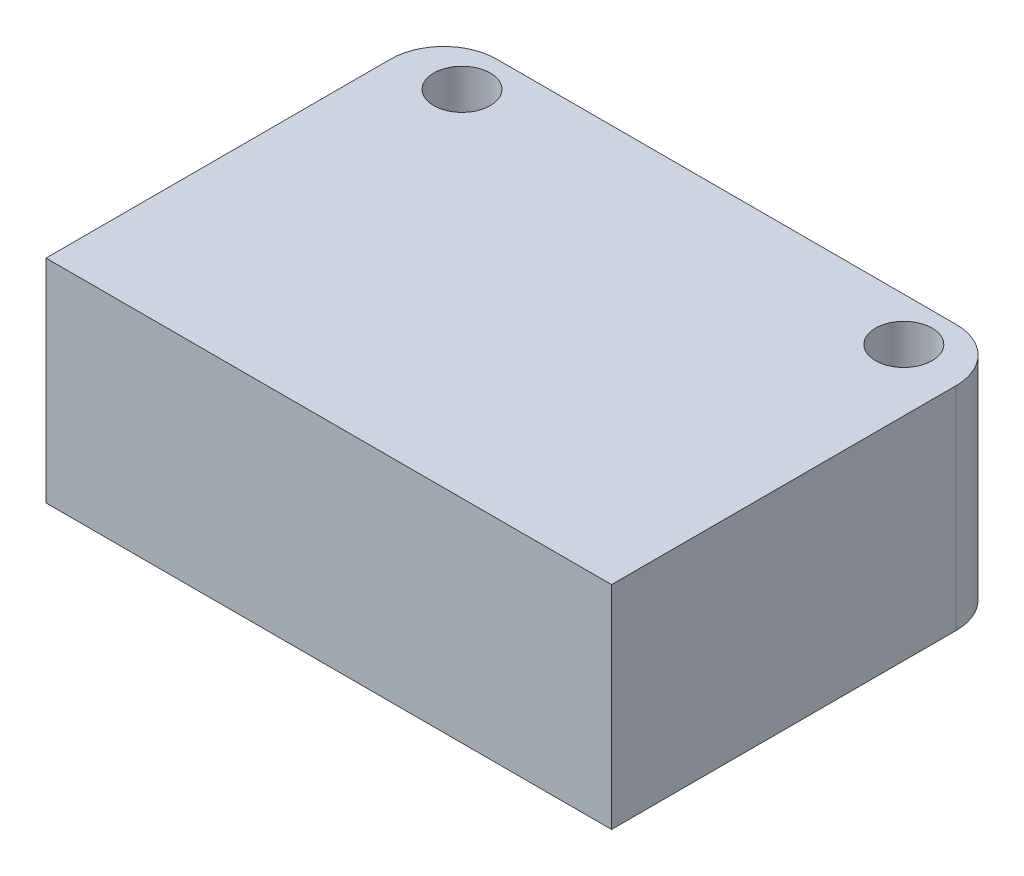
ISO-10303-21;
HEADER;
FILE_DESCRIPTION(('STEP AP214'),'2;1');
FILE_NAME('part.step','',(''),(''),'','','');
FILE_SCHEMA(('AUTOMOTIVE_DESIGN { 1 0 10303 214 1 1 1 1 }'));
ENDSEC;
DATA;
#1=APPLICATION_CONTEXT('core data for automotive mechanical design processes');
#2=APPLICATION_PROTOCOL_DEFINITION('international standard','automotive_design',2000,#1);
#3=PRODUCT_CONTEXT('',#1,'mechanical');
#4=PRODUCT('Part','Part','',(#3));
#5=PRODUCT_RELATED_PRODUCT_CATEGORY('part','',(#4));
#6=PRODUCT_DEFINITION_FORMATION('','',#4);
#7=PRODUCT_DEFINITION_CONTEXT('part definition',#1,'design');
#8=PRODUCT_DEFINITION('design','',#6,#7);
#9=PRODUCT_DEFINITION_SHAPE('','',#8);
#10=(LENGTH_UNIT() NAMED_UNIT(*) SI_UNIT(.MILLI.,.METRE.));
#11=(NAMED_UNIT(*) PLANE_ANGLE_UNIT() SI_UNIT($,.RADIAN.));
#12=(NAMED_UNIT(*) SI_UNIT($,.STERADIAN.) SOLID_ANGLE_UNIT());
#13=UNCERTAINTY_MEASURE_WITH_UNIT(LENGTH_MEASURE(1.E-05),#10,'distance_accuracy_value','');
#14=(GEOMETRIC_REPRESENTATION_CONTEXT(3) GLOBAL_UNCERTAINTY_ASSIGNED_CONTEXT((#13)) GLOBAL_UNIT_ASSIGNED_CONTEXT((#10,
#11,#12)) REPRESENTATION_CONTEXT('',''));
#15=CARTESIAN_POINT('',(0.,0.,0.));
#16=DIRECTION('',(0.,0.,1.));
#17=DIRECTION('',(1.,0.,0.));
#18=AXIS2_PLACEMENT_3D('',#15,#16,#17);
#19=CARTESIAN_POINT('',(-13.,6.,-8.25));
#20=DIRECTION('',(0.,-1.,0.));
#21=DIRECTION('',(0.,0.,-1.));
#22=AXIS2_PLACEMENT_3D('',#19,#20,#21);
#23=PLANE('',#22);
#24=DIRECTION('',(0.,0.,1.));
#25=VECTOR('',#24,1.);
#26=CARTESIAN_POINT('',(-16.,6.,11.25));
#27=LINE('',#26,#25);
#28=CARTESIAN_POINT('',(-16.,6.,-8.25));
#29=VERTEX_POINT('',#28);
#30=CARTESIAN_POINT('',(-16.,6.,11.25));
#31=VERTEX_POINT('',#30);
#32=EDGE_CURVE('E125',#29,#31,#27,.T.);
#33=ORIENTED_EDGE('',*,*,#32,.T.);
#34=DIRECTION('',(1.,0.,0.));
#35=VECTOR('',#34,1.);
#36=CARTESIAN_POINT('',(-16.,6.,11.25));
#37=LINE('',#36,#35);
#38=CARTESIAN_POINT('',(16.,6.,11.25));
#39=VERTEX_POINT('',#38);
#40=EDGE_CURVE('E114',#31,#39,#37,.T.);
#41=ORIENTED_EDGE('',*,*,#40,.T.);
#42=DIRECTION('',(0.,0.,-1.));
#43=VECTOR('',#42,1.);
#44=CARTESIAN_POINT('',(16.,6.,11.25));
#45=LINE('',#44,#43);
#46=CARTESIAN_POINT('',(16.,6.,-8.25));
#47=VERTEX_POINT('',#46);
#48=EDGE_CURVE('E124',#39,#47,#45,.T.);
#49=ORIENTED_EDGE('',*,*,#48,.T.);
#50=CARTESIAN_POINT('',(13.,6.,-8.25));
#51=DIRECTION('',(0.,1.,0.));
#52=DIRECTION('',(0.,0.,-1.));
#53=AXIS2_PLACEMENT_3D('',#50,#51,#52);
#54=CIRCLE('',#53,3.);
#55=CARTESIAN_POINT('',(13.,6.,-11.25));
#56=VERTEX_POINT('',#55);
#57=EDGE_CURVE('E211',#47,#56,#54,.T.);
#58=ORIENTED_EDGE('',*,*,#57,.T.);
#59=DIRECTION('',(-1.,0.,0.));
#60=VECTOR('',#59,1.);
#61=CARTESIAN_POINT('',(-13.,6.,-11.25));
#62=LINE('',#61,#60);
#63=CARTESIAN_POINT('',(-13.,6.,-11.25));
#64=VERTEX_POINT('',#63);
#65=EDGE_CURVE('E213',#56,#64,#62,.T.);
#66=ORIENTED_EDGE('',*,*,#65,.T.);
#67=CARTESIAN_POINT('',(-13.,6.,-8.25));
#68=DIRECTION('',(0.,1.,0.));
#69=DIRECTION('',(0.,0.,-1.));
#70=AXIS2_PLACEMENT_3D('',#67,#68,#69);
#71=CIRCLE('',#70,3.);
#72=EDGE_CURVE('E130',#64,#29,#71,.T.);
#73=ORIENTED_EDGE('',*,*,#72,.T.);
#74=EDGE_LOOP('',(#33,#41,#49,#58,#66,#73));
#75=FACE_BOUND('',#74,.T.);
#76=CARTESIAN_POINT('',(12.5,6.,-8.78906249999999));
#77=DIRECTION('',(0.,1.,0.));
#78=DIRECTION('',(0.,0.,1.));
#79=AXIS2_PLACEMENT_3D('',#76,#77,#78);
#80=CIRCLE('',#79,1.6);
#81=CARTESIAN_POINT('',(12.5,6.,-7.1890625));
#82=VERTEX_POINT('',#81);
#83=EDGE_CURVE('E205',#82,#82,#80,.T.);
#84=ORIENTED_EDGE('',*,*,#83,.F.);
#85=EDGE_LOOP('',(#84));
#86=FACE_BOUND('',#85,.T.);
#87=CARTESIAN_POINT('',(-12.5,6.,-8.78906249999999));
#88=DIRECTION('',(0.,1.,0.));
#89=DIRECTION('',(0.,0.,-1.));
#90=AXIS2_PLACEMENT_3D('',#87,#88,#89);
#91=CIRCLE('',#90,1.6);
#92=CARTESIAN_POINT('',(-12.5,6.,-10.3890625));
#93=VERTEX_POINT('',#92);
#94=EDGE_CURVE('E199',#93,#93,#91,.T.);
#95=ORIENTED_EDGE('',*,*,#94,.F.);
#96=EDGE_LOOP('',(#95));
#97=FACE_BOUND('',#96,.T.);
#98=ADVANCED_FACE('F41',(#75,#86,#97),#23,.F.);
#99=CARTESIAN_POINT('',(-13.,-6.,-8.25));
#100=DIRECTION('',(0.,-1.,0.));
#101=DIRECTION('',(0.,0.,-1.));
#102=AXIS2_PLACEMENT_3D('',#99,#100,#101);
#103=PLANE('',#102);
#104=CARTESIAN_POINT('',(12.5,-6.,-8.78906249999999));
#105=DIRECTION('',(0.,1.,0.));
#106=DIRECTION('',(0.,0.,1.));
#107=AXIS2_PLACEMENT_3D('',#104,#105,#106);
#108=CIRCLE('',#107,1.6);
#109=CARTESIAN_POINT('',(12.5,-6.,-7.1890625));
#110=VERTEX_POINT('',#109);
#111=EDGE_CURVE('E203',#110,#110,#108,.T.);
#112=ORIENTED_EDGE('',*,*,#111,.T.);
#113=EDGE_LOOP('',(#112));
#114=FACE_BOUND('',#113,.T.);
#115=DIRECTION('',(0.,0.,1.));
#116=VECTOR('',#115,1.);
#117=CARTESIAN_POINT('',(-16.,-6.,11.25));
#118=LINE('',#117,#116);
#119=CARTESIAN_POINT('',(-16.,-6.,-8.25));
#120=VERTEX_POINT('',#119);
#121=CARTESIAN_POINT('',(-16.,-6.,11.25));
#122=VERTEX_POINT('',#121);
#123=EDGE_CURVE('E136',#120,#122,#118,.T.);
#124=ORIENTED_EDGE('',*,*,#123,.F.);
#125=CARTESIAN_POINT('',(-13.,-6.,-8.25));
#126=DIRECTION('',(0.,1.,0.));
#127=DIRECTION('',(0.,0.,-1.));
#128=AXIS2_PLACEMENT_3D('',#125,#126,#127);
#129=CIRCLE('',#128,3.);
#130=CARTESIAN_POINT('',(-13.,-6.,-11.25));
#131=VERTEX_POINT('',#130);
#132=EDGE_CURVE('E132',#131,#120,#129,.T.);
#133=ORIENTED_EDGE('',*,*,#132,.F.);
#134=DIRECTION('',(-1.,0.,0.));
#135=VECTOR('',#134,1.);
#136=CARTESIAN_POINT('',(-13.,-6.,-11.25));
#137=LINE('',#136,#135);
#138=CARTESIAN_POINT('',(13.,-6.,-11.25));
#139=VERTEX_POINT('',#138);
#140=EDGE_CURVE('E224',#139,#131,#137,.T.);
#141=ORIENTED_EDGE('',*,*,#140,.F.);
#142=CARTESIAN_POINT('',(13.,-6.,-8.25));
#143=DIRECTION('',(0.,1.,0.));
#144=DIRECTION('',(0.,0.,-1.));
#145=AXIS2_PLACEMENT_3D('',#142,#143,#144);
#146=CIRCLE('',#145,3.);
#147=CARTESIAN_POINT('',(16.,-6.,-8.25));
#148=VERTEX_POINT('',#147);
#149=EDGE_CURVE('E222',#148,#139,#146,.T.);
#150=ORIENTED_EDGE('',*,*,#149,.F.);
#151=DIRECTION('',(0.,0.,-1.));
#152=VECTOR('',#151,1.);
#153=CARTESIAN_POINT('',(16.,-6.,11.25));
#154=LINE('',#153,#152);
#155=CARTESIAN_POINT('',(16.,-6.,11.25));
#156=VERTEX_POINT('',#155);
#157=EDGE_CURVE('E220',#156,#148,#154,.T.);
#158=ORIENTED_EDGE('',*,*,#157,.F.);
#159=DIRECTION('',(1.,0.,0.));
#160=VECTOR('',#159,1.);
#161=CARTESIAN_POINT('',(-16.,-6.,11.25));
#162=LINE('',#161,#160);
#163=EDGE_CURVE('E218',#122,#156,#162,.T.);
#164=ORIENTED_EDGE('',*,*,#163,.F.);
#165=EDGE_LOOP('',(#124,#133,#141,#150,#158,#164));
#166=FACE_BOUND('',#165,.T.);
#167=CARTESIAN_POINT('',(-12.5,-6.,-8.78906249999999));
#168=DIRECTION('',(0.,1.,0.));
#169=DIRECTION('',(0.,0.,-1.));
#170=AXIS2_PLACEMENT_3D('',#167,#168,#169);
#171=CIRCLE('',#170,1.6);
#172=CARTESIAN_POINT('',(-12.5,-6.,-10.3890625));
#173=VERTEX_POINT('',#172);
#174=EDGE_CURVE('E194',#173,#173,#171,.T.);
#175=ORIENTED_EDGE('',*,*,#174,.T.);
#176=EDGE_LOOP('',(#175));
#177=FACE_BOUND('',#176,.T.);
#178=ADVANCED_FACE('F182',(#114,#166,#177),#103,.T.);
#179=CARTESIAN_POINT('',(-16.,6.,11.25));
#180=DIRECTION('',(1.,0.,0.));
#181=DIRECTION('',(0.,0.,-1.));
#182=AXIS2_PLACEMENT_3D('',#179,#180,#181);
#183=PLANE('',#182);
#184=DIRECTION('',(0.,-1.,0.));
#185=VECTOR('',#184,1.);
#186=CARTESIAN_POINT('',(-16.,6.,-8.25));
#187=LINE('',#186,#185);
#188=CARTESIAN_POINT('',(-16.,3.,-8.25));
#189=VERTEX_POINT('',#188);
#190=EDGE_CURVE('E228',#29,#189,#187,.T.);
#191=ORIENTED_EDGE('',*,*,#190,.T.);
#192=CARTESIAN_POINT('',(-16.,0.,-4.25));
#193=DIRECTION('',(1.,0.,0.));
#194=DIRECTION('',(0.,0.,-1.));
#195=AXIS2_PLACEMENT_3D('',#192,#193,#194);
#196=CIRCLE('',#195,5.);
#197=CARTESIAN_POINT('',(-16.,-3.,-8.25));
#198=VERTEX_POINT('',#197);
#199=EDGE_CURVE('E55',#189,#198,#196,.T.);
#200=ORIENTED_EDGE('',*,*,#199,.T.);
#201=EDGE_CURVE('E216',#198,#120,#187,.T.);
#202=ORIENTED_EDGE('',*,*,#201,.T.);
#203=ORIENTED_EDGE('',*,*,#123,.T.);
#204=DIRECTION('',(0.,-1.,0.));
#205=VECTOR('',#204,1.);
#206=CARTESIAN_POINT('',(-16.,6.,11.25));
#207=LINE('',#206,#205);
#208=EDGE_CURVE('E118',#31,#122,#207,.T.);
#209=ORIENTED_EDGE('',*,*,#208,.F.);
#210=ORIENTED_EDGE('',*,*,#32,.F.);
#211=EDGE_LOOP('',(#191,#200,#202,#203,#209,#210));
#212=FACE_BOUND('',#211,.T.);
#213=ADVANCED_FACE('F134',(#212),#183,.F.);
#214=CARTESIAN_POINT('',(-16.,6.,11.25));
#215=DIRECTION('',(0.,0.,-1.));
#216=DIRECTION('',(-1.,0.,0.));
#217=AXIS2_PLACEMENT_3D('',#214,#215,#216);
#218=PLANE('',#217);
#219=ORIENTED_EDGE('',*,*,#163,.T.);
#220=DIRECTION('',(0.,-1.,0.));
#221=VECTOR('',#220,1.);
#222=CARTESIAN_POINT('',(16.,6.,11.25));
#223=LINE('',#222,#221);
#224=EDGE_CURVE('E121',#39,#156,#223,.T.);
#225=ORIENTED_EDGE('',*,*,#224,.F.);
#226=ORIENTED_EDGE('',*,*,#40,.F.);
#227=ORIENTED_EDGE('',*,*,#208,.T.);
#228=EDGE_LOOP('',(#219,#225,#226,#227));
#229=FACE_BOUND('',#228,.T.);
#230=ADVANCED_FACE('F116',(#229),#218,.F.);
#231=CARTESIAN_POINT('',(16.,6.,11.25));
#232=DIRECTION('',(-1.,0.,0.));
#233=DIRECTION('',(0.,0.,1.));
#234=AXIS2_PLACEMENT_3D('',#231,#232,#233);
#235=PLANE('',#234);
#236=ORIENTED_EDGE('',*,*,#157,.T.);
#237=DIRECTION('',(0.,-1.,0.));
#238=VECTOR('',#237,1.);
#239=CARTESIAN_POINT('',(16.,6.,-8.25));
#240=LINE('',#239,#238);
#241=EDGE_CURVE('E141',#47,#148,#240,.T.);
#242=ORIENTED_EDGE('',*,*,#241,.F.);
#243=ORIENTED_EDGE('',*,*,#48,.F.);
#244=ORIENTED_EDGE('',*,*,#224,.T.);
#245=EDGE_LOOP('',(#236,#242,#243,#244));
#246=FACE_BOUND('',#245,.T.);
#247=ADVANCED_FACE('F316',(#246),#235,.F.);
#248=CARTESIAN_POINT('',(13.,6.,-8.25));
#249=DIRECTION('',(0.,-1.,0.));
#250=DIRECTION('',(0.,0.,-1.));
#251=AXIS2_PLACEMENT_3D('',#248,#249,#250);
#252=CYLINDRICAL_SURFACE('',#251,3.);
#253=ORIENTED_EDGE('',*,*,#149,.T.);
#254=DIRECTION('',(0.,-1.,0.));
#255=VECTOR('',#254,1.);
#256=CARTESIAN_POINT('',(13.,6.,-11.25));
#257=LINE('',#256,#255);
#258=EDGE_CURVE('E233',#56,#139,#257,.T.);
#259=ORIENTED_EDGE('',*,*,#258,.F.);
#260=ORIENTED_EDGE('',*,*,#57,.F.);
#261=ORIENTED_EDGE('',*,*,#241,.T.);
#262=EDGE_LOOP('',(#253,#259,#260,#261));
#263=FACE_BOUND('',#262,.T.);
#264=ADVANCED_FACE('F240',(#263),#252,.T.);
#265=CARTESIAN_POINT('',(-13.,6.,-11.25));
#266=DIRECTION('',(0.,0.,1.));
#267=DIRECTION('',(1.,0.,0.));
#268=AXIS2_PLACEMENT_3D('',#265,#266,#267);
#269=PLANE('',#268);
#270=ORIENTED_EDGE('',*,*,#140,.T.);
#271=DIRECTION('',(0.,-1.,0.));
#272=VECTOR('',#271,1.);
#273=CARTESIAN_POINT('',(-13.,6.,-11.25));
#274=LINE('',#273,#272);
#275=EDGE_CURVE('E230',#64,#131,#274,.T.);
#276=ORIENTED_EDGE('',*,*,#275,.F.);
#277=ORIENTED_EDGE('',*,*,#65,.F.);
#278=ORIENTED_EDGE('',*,*,#258,.T.);
#279=EDGE_LOOP('',(#270,#276,#277,#278));
#280=FACE_BOUND('',#279,.T.);
#281=ADVANCED_FACE('F180',(#280),#269,.F.);
#282=CARTESIAN_POINT('',(-13.,6.,-8.25));
#283=DIRECTION('',(0.,-1.,0.));
#284=DIRECTION('',(0.,0.,-1.));
#285=AXIS2_PLACEMENT_3D('',#282,#283,#284);
#286=CYLINDRICAL_SURFACE('',#285,3.);
#287=ORIENTED_EDGE('',*,*,#201,.F.);
#288=CARTESIAN_POINT('',(-15.9199034871018,-3.93726555508285,-7.56140459919428));
#289=CARTESIAN_POINT('',(-15.7595113181354,-3.02004653263133,-6.88128147766192));
#290=CARTESIAN_POINT('',(-16.893204649469,-3.14981244406628,-6.71549823914056));
#291=CARTESIAN_POINT('',(-15.9350462864793,-3.87028032088831,-7.62560777710186));
#292=CARTESIAN_POINT('',(-15.7858940474417,-2.97881452982527,-6.92654541509743));
#293=CARTESIAN_POINT('',(-16.9133950493653,-3.09622425671064,-6.78398162881023));
#294=CARTESIAN_POINT('',(-15.9476369028812,-3.80013774363885,-7.68848099843595));
#295=CARTESIAN_POINT('',(-15.8110234789429,-2.93508097939461,-6.97310725562102));
#296=CARTESIAN_POINT('',(-16.930182537999,-3.04011019491107,-6.85104639822011));
#297=CARTESIAN_POINT('',(-15.9683515893614,-3.6540660423742,-7.81097906062191));
#298=CARTESIAN_POINT('',(-15.8580576507199,-2.84240401304903,-7.06756470110909));
#299=CARTESIAN_POINT('',(-16.9578021197072,-2.92325283389935,-6.98171099792121));
#300=CARTESIAN_POINT('',(-15.9764808127062,-3.57814371040936,-7.87060757731189));
#301=CARTESIAN_POINT('',(-15.8799721266198,-2.79359434825517,-7.11537657132308));
#302=CARTESIAN_POINT('',(-16.9686410838043,-2.86251496832749,-7.04531474910632));
#303=CARTESIAN_POINT('',(-15.9951103441567,-3.34304987611232,-8.04337905885738));
#304=CARTESIAN_POINT('',(-15.9398871201272,-2.64007217355325,-7.2583561308812));
#305=CARTESIAN_POINT('',(-16.9934804584856,-2.67443990088986,-7.22960432950032));
#306=CARTESIAN_POINT('',(-15.9999923498305,-3.17586449610729,-8.15106776810432));
#307=CARTESIAN_POINT('',(-15.9732826396424,-2.52655544836861,-7.35511778591591));
#308=CARTESIAN_POINT('',(-16.9999897996536,-2.54069159688584,-7.34447228599264));
#309=CARTESIAN_POINT('',(-16.0000096707888,-2.77768487287632,-8.37506294446776));
#310=CARTESIAN_POINT('',(-16.0327822757599,-2.24471611147927,-7.56642074161455));
#311=CARTESIAN_POINT('',(-17.0000128945372,-2.22214789830105,-7.58340047408036));
#312=CARTESIAN_POINT('',(-15.9922300334133,-2.54150036140937,-8.48613287991862));
#313=CARTESIAN_POINT('',(-16.0555663650771,-2.06952565124576,-7.68021621754257));
#314=CARTESIAN_POINT('',(-16.9896400446167,-2.03320028912747,-7.70187507191286));
#315=CARTESIAN_POINT('',(-15.9709610302373,-2.04767714715251,-8.67745779097013));
#316=CARTESIAN_POINT('',(-16.0850535788086,-1.68932964224154,-7.88232998788569));
#317=CARTESIAN_POINT('',(-16.961281373584,-1.63814171772203,-7.90595497703514));
#318=CARTESIAN_POINT('',(-15.9574592359218,-1.78999273089362,-8.7576449613081));
#319=CARTESIAN_POINT('',(-16.0922574692798,-1.48392817317328,-7.97191490488993));
#320=CARTESIAN_POINT('',(-16.9432789811183,-1.43199418471499,-7.99148795871131));
#321=CARTESIAN_POINT('',(-15.9389429816808,-1.39310913979663,-8.85301403153293));
#322=CARTESIAN_POINT('',(-16.0975507601924,-1.16036741709406,-8.07996327035388));
#323=CARTESIAN_POINT('',(-16.9185906422964,-1.11448731183726,-8.09321496697713));
#324=CARTESIAN_POINT('',(-15.9330605864259,-1.2590963118529,-8.88065091624967));
#325=CARTESIAN_POINT('',(-16.0984181997967,-1.05045057886345,-8.11158460406975));
#326=CARTESIAN_POINT('',(-16.9107474487174,-1.0072770494822,-8.12269431069239));
#327=CARTESIAN_POINT('',(-15.9226041463373,-0.988395806106641,-8.92747389793562));
#328=CARTESIAN_POINT('',(-16.0992514097917,-0.827129356243141,-8.16538350036124));
#329=CARTESIAN_POINT('',(-16.8968055285756,-0.790716644885194,-8.17263882448676));
#330=CARTESIAN_POINT('',(-15.9180296076098,-0.85170915892408,-8.94666318650287));
#331=CARTESIAN_POINT('',(-16.0992251733044,-0.713474387065728,-8.18770078630855));
#332=CARTESIAN_POINT('',(-16.8907061434879,-0.681367327139232,-8.19310739893711));
#333=CARTESIAN_POINT('',(-15.9107617624154,-0.576703141103986,-8.97642892827938));
#334=CARTESIAN_POINT('',(-16.0989555450587,-0.484112715980543,-8.22234342065058));
#335=CARTESIAN_POINT('',(-16.8810156832124,-0.461362512883221,-8.22485752349729));
#336=CARTESIAN_POINT('',(-15.9080670185425,-0.438385100416466,-8.98701196338413));
#337=CARTESIAN_POINT('',(-16.098712984344,-0.368112173161939,-8.23476958914958));
#338=CARTESIAN_POINT('',(-16.8774226914832,-0.350708080333181,-8.23614609429558));
#339=CARTESIAN_POINT('',(-15.9048730850482,-0.16100807717886,-8.99950320707876));
#340=CARTESIAN_POINT('',(-16.0984100723516,-0.135403384941361,-8.2494047363819));
#341=CARTESIAN_POINT('',(-16.8731641134819,-0.128806461743075,-8.24947008756772));
#342=CARTESIAN_POINT('',(-15.9043738466614,-0.0219491111544606,-9.0014116083445));
#343=CARTESIAN_POINT('',(-16.0983489350453,-0.0183749633055676,-8.25165454268143));
#344=CARTESIAN_POINT('',(-16.8724984621895,-0.0175592889235565,-8.25150571556247));
#345=CARTESIAN_POINT('',(-15.9056265221065,0.254952496101558,-8.99655225035538));
#346=CARTESIAN_POINT('',(-16.098480046901,0.214176059035191,-8.24595442185979));
#347=CARTESIAN_POINT('',(-16.8741686961676,0.203961996881235,-8.24632240038403));
#348=CARTESIAN_POINT('',(-15.907363467187,0.392797070516248,-8.98984218282657));
#349=CARTESIAN_POINT('',(-16.0986709859866,0.330023516103903,-8.23805665613938));
#350=CARTESIAN_POINT('',(-16.8764846231013,0.314237656412964,-8.2391649950516));
#351=CARTESIAN_POINT('',(-15.9128588713202,0.667251805104602,-8.96789988271643));
#352=CARTESIAN_POINT('',(-16.099051459065,0.559670462546013,-8.21242556062941));
#353=CARTESIAN_POINT('',(-16.8838118286078,0.533801444083672,-8.2157598749339));
#354=CARTESIAN_POINT('',(-15.9166181087221,0.803861469381865,-8.95266436873081));
#355=CARTESIAN_POINT('',(-16.0992415013236,0.673772047695514,-8.19461922103679));
#356=CARTESIAN_POINT('',(-16.8888241449794,0.643089175505529,-8.19950865998403));
#357=CARTESIAN_POINT('',(-15.9257119484978,1.07488387131941,-8.91378339923721));
#358=CARTESIAN_POINT('',(-16.0990745244293,0.898603154585567,-8.14964815802165));
#359=CARTESIAN_POINT('',(-16.9009492646471,0.859907097055487,-8.15803562584852));
#360=CARTESIAN_POINT('',(-15.9310469878234,1.20929598870076,-8.89013561072973));
#361=CARTESIAN_POINT('',(-16.0987137395984,1.00960077244712,-8.12236469833884));
#362=CARTESIAN_POINT('',(-16.9080626505457,0.967436790960449,-8.13281131813009));
#363=CARTESIAN_POINT('',(-15.9426232508413,1.47500364587425,-8.83460841308118));
#364=CARTESIAN_POINT('',(-16.0966711094145,1.22700362800415,-8.05917119027874));
#365=CARTESIAN_POINT('',(-16.923497667938,1.18000291669923,-8.07358230731108));
#366=CARTESIAN_POINT('',(-15.948864750143,1.60629822360044,-8.80272649804906));
#367=CARTESIAN_POINT('',(-16.0949748131892,1.33362498330406,-8.02310762859055));
#368=CARTESIAN_POINT('',(-16.9318196669109,1.2850385788803,-8.03957493126004));
#369=CARTESIAN_POINT('',(-15.9661182277742,1.96145544990814,-8.70412216808942));
#370=CARTESIAN_POINT('',(-16.0871630600607,1.6196823610153,-7.91300927553982));
#371=CARTESIAN_POINT('',(-16.9548243036056,1.56916435992661,-7.93439697928193));
#372=CARTESIAN_POINT('',(-15.9772174052568,2.18134993615239,-8.62914616947287));
#373=CARTESIAN_POINT('',(-16.0786151155119,1.79272441113413,-7.83076749897557));
#374=CARTESIAN_POINT('',(-16.969623206952,1.74507994892194,-7.85442258077183));
#375=CARTESIAN_POINT('',(-15.9941560382703,2.60426515107954,-8.45625906972824));
#376=CARTESIAN_POINT('',(-16.0494542604125,2.11538757500212,-7.6502102631023));
#377=CARTESIAN_POINT('',(-16.992208051084,2.08341212086361,-7.67000967437603));
#378=CARTESIAN_POINT('',(-16.0000063063153,2.80731978185302,-8.35839564269263));
#379=CARTESIAN_POINT('',(-16.0284896316404,2.26515145239739,-7.55111777948957));
#380=CARTESIAN_POINT('',(-17.0000084085549,2.24585582548241,-7.5656220188557));
#381=CARTESIAN_POINT('',(-15.9999942467772,3.17578128735751,-8.1511111477883));
#382=CARTESIAN_POINT('',(-15.9732812244824,2.52646664294401,-7.35516749092705));
#383=CARTESIAN_POINT('',(-16.9999923289136,2.54062502988601,-7.34451855765585));
#384=CARTESIAN_POINT('',(-15.9951141662884,3.34292812747267,-8.04345651155493));
#385=CARTESIAN_POINT('',(-15.9399087445551,2.63998265212883,-7.25842808712816));
#386=CARTESIAN_POINT('',(-16.9934855546294,2.67434250197814,-7.22968694571533));
#387=CARTESIAN_POINT('',(-15.9764938885209,3.57801562017777,-7.87070775901646));
#388=CARTESIAN_POINT('',(-15.8800099612076,2.79351497516173,-7.11545636329446));
#389=CARTESIAN_POINT('',(-16.96865851824,2.86241249614221,-7.04542160958902));
#390=CARTESIAN_POINT('',(-15.9683637160545,3.65396949076689,-7.8110580074216));
#391=CARTESIAN_POINT('',(-15.858087985353,2.84234413480323,-7.06762603379192));
#392=CARTESIAN_POINT('',(-16.9578182886793,2.9231755926135,-6.98179520783439));
#393=CARTESIAN_POINT('',(-15.9476447243776,3.8000936462598,-7.68852000889531));
#394=CARTESIAN_POINT('',(-15.8110382199117,2.93505204158442,-6.97313642241488));
#395=CARTESIAN_POINT('',(-16.9301929667325,3.04007491700783,-6.85108800936707));
#396=CARTESIAN_POINT('',(-15.9350511271453,3.87025763357094,-7.62562835345574));
#397=CARTESIAN_POINT('',(-15.785900924635,2.97879738872483,-6.9265607906497));
#398=CARTESIAN_POINT('',(-16.9134015036504,3.09620610685674,-6.78400357691243));
#399=CARTESIAN_POINT('',(-15.9199034871018,3.93726555508285,-7.56140459919428));
#400=CARTESIAN_POINT('',(-15.7595113181354,3.02004653263133,-6.88128147766192));
#401=CARTESIAN_POINT('',(-16.893204649469,3.14981244406628,-6.71549823914056));
#402=(BOUNDED_SURFACE() B_SPLINE_SURFACE(3,2,((#288,#289,#290),(#291,#292,#293),(#294,#295,
#296),(#297,#298,#299),(#300,#301,#302),(#303,#304,#305),(#306,#307,#308),(#309,#310,#311),
(#312,#313,#314),(#315,#316,#317),(#318,#319,#320),(#321,#322,#323),(#324,#325,#326),(#327,#328,
#329),(#330,#331,#332),(#333,#334,#335),(#336,#337,#338),(#339,#340,#341),(#342,#343,#344),
(#345,#346,#347),(#348,#349,#350),(#351,#352,#353),(#354,#355,#356),(#357,#358,#359),(#360,#361,
#362),(#363,#364,#365),(#366,#367,#368),(#369,#370,#371),(#372,#373,#374),(#375,#376,#377),
(#378,#379,#380),(#381,#382,#383),(#384,#385,#386),(#387,#388,#389),(#390,#391,#392),(#393,#394,
#395),(#396,#397,#398),(#399,#400,#401)),.UNSPECIFIED.,.F.,.F.,
.F.) B_SPLINE_SURFACE_WITH_KNOTS((4,2,2,2,2,2,2,2,2,2,2,2,2,2,2,2,2,2,4),(3,3),(0.,
0.331424192876583,0.662464754171419,1.32119264403096,2.15390861465357,2.9884425878844,
3.40566243553363,3.82272451720633,4.23946733713883,4.65620090057969,5.07015934870237,
5.48427723718861,5.89851006379399,6.31286910269363,7.03616508128768,7.75796765932744,
8.41646487095615,8.74763503702941,9.07916079135143),(0.,1.),
.UNSPECIFIED.) GEOMETRIC_REPRESENTATION_ITEM() RATIONAL_B_SPLINE_SURFACE(((1.,0.655180294900864,
1.),(1.,0.658712250211258,1.),(1.,0.662565759424161,1.),(1.,0.670731581563067,1.),(1.,
0.675043358249415,1.),(1.,0.688358838275648,1.),(1.,0.697782074082981,1.),(1.,0.718894398875202,
1.),(1.,0.730524565915049,1.),(1.,0.751544508043644,1.),(1.,0.760929336428042,1.),(1.,
0.772356665251054,1.),(1.,0.775724007165109,1.),(1.,0.781480602584846,1.),(1.,0.78387022545979,
1.),(1.,0.787593972884302,1.),(1.,0.78892890401935,1.),(1.,0.790505852466255,1.),(1.,
0.790747894052731,1.),(1.,0.790133419522428,1.),(1.,0.789284208196124,1.),(1.,0.786525485943758,
1.),(1.,0.784615566758355,1.),(1.,0.779792253174952,1.),(1.,0.776878580410264,1.),(1.,
0.770139512876191,1.),(1.,0.766313840585393,1.),(1.,0.754713505932297,1.),(1.,0.746121203051626,
1.),(1.,0.727425248090398,1.),(1.,0.717324753145669,1.),(1.,0.69778497180502,1.),(1.,
0.688365388301769,1.),(1.,0.675050788940685,1.),(1.,0.670737099303482,1.),(1.,0.662568103800722,
1.),(1.,0.658713295090088,1.),(1.,0.655180294900864,1.))) REPRESENTATION_ITEM('') SURFACE());
#403=CARTESIAN_POINT('',(-15.9199034871018,-3.93726555508285,-7.56140459919428));
#404=CARTESIAN_POINT('',(-15.9350462864793,-3.87028032088831,-7.62560777710185));
#405=CARTESIAN_POINT('',(-15.9476369028812,-3.80013774363885,-7.68848099843594));
#406=CARTESIAN_POINT('',(-15.9683515893614,-3.6540660423742,-7.81097906062191));
#407=CARTESIAN_POINT('',(-15.9764808127062,-3.57814371040937,-7.87060757731189));
#408=CARTESIAN_POINT('',(-15.9951103441567,-3.34304987611232,-8.04337905885738));
#409=CARTESIAN_POINT('',(-15.9999923498305,-3.17586449610729,-8.15106776810432));
#410=CARTESIAN_POINT('',(-16.0000096707888,-2.77768487287632,-8.37506294446776));
#411=CARTESIAN_POINT('',(-15.9922300334133,-2.54150036140937,-8.48613287991862));
#412=CARTESIAN_POINT('',(-15.9709610302373,-2.04767714715251,-8.67745779097013));
#413=CARTESIAN_POINT('',(-15.9574592359218,-1.78999273089362,-8.7576449613081));
#414=CARTESIAN_POINT('',(-15.9389429816808,-1.39310913979663,-8.85301403153293));
#415=CARTESIAN_POINT('',(-15.9330605864259,-1.2590963118529,-8.88065091624968));
#416=CARTESIAN_POINT('',(-15.9226041463373,-0.988395806106641,-8.92747389793562));
#417=CARTESIAN_POINT('',(-15.9180296076098,-0.85170915892408,-8.94666318650287));
#418=CARTESIAN_POINT('',(-15.9107617624154,-0.576703141103986,-8.97642892827938));
#419=CARTESIAN_POINT('',(-15.9080670185425,-0.438385100416466,-8.98701196338413));
#420=CARTESIAN_POINT('',(-15.9048730850482,-0.161008077178861,-8.99950320707876));
#421=CARTESIAN_POINT('',(-15.9043738466614,-0.0219491111544606,-9.0014116083445));
#422=CARTESIAN_POINT('',(-15.9056265221065,0.254952496101559,-8.99655225035538));
#423=CARTESIAN_POINT('',(-15.907363467187,0.392797070516248,-8.98984218282657));
#424=CARTESIAN_POINT('',(-15.9128588713202,0.667251805104602,-8.96789988271643));
#425=CARTESIAN_POINT('',(-15.9166181087221,0.803861469381865,-8.95266436873081));
#426=CARTESIAN_POINT('',(-15.9257119484978,1.07488387131941,-8.91378339923721));
#427=CARTESIAN_POINT('',(-15.9310469878234,1.20929598870076,-8.89013561072973));
#428=CARTESIAN_POINT('',(-15.9426232508413,1.47500364587425,-8.83460841308118));
#429=CARTESIAN_POINT('',(-15.948864750143,1.60629822360044,-8.80272649804906));
#430=CARTESIAN_POINT('',(-15.9661182277742,1.96145544990813,-8.70412216808942));
#431=CARTESIAN_POINT('',(-15.9772174052568,2.18134993615239,-8.62914616947287));
#432=CARTESIAN_POINT('',(-15.9941560382703,2.60426515107954,-8.45625906972824));
#433=CARTESIAN_POINT('',(-16.0000063063153,2.80731978185302,-8.35839564269263));
#434=CARTESIAN_POINT('',(-15.9999942467772,3.17578128735751,-8.1511111477883));
#435=CARTESIAN_POINT('',(-15.9951141662884,3.34292812747267,-8.04345651155493));
#436=CARTESIAN_POINT('',(-15.9764938885209,3.57801562017777,-7.87070775901646));
#437=CARTESIAN_POINT('',(-15.9683637160545,3.65396949076689,-7.8110580074216));
#438=CARTESIAN_POINT('',(-15.9476447243776,3.8000936462598,-7.68852000889531));
#439=CARTESIAN_POINT('',(-15.9350511271453,3.87025763357094,-7.62562835345574));
#440=CARTESIAN_POINT('',(-15.9199034871018,3.93726555508285,-7.56140459919428));
#441=B_SPLINE_CURVE_WITH_KNOTS('',3,(#403,#404,#405,#406,#407,#408,#409,#410,#411,#412,#413,
#414,#415,#416,#417,#418,#419,#420,#421,#422,#423,#424,#425,#426,#427,#428,#429,#430,#431,#432,
#433,#434,#435,#436,#437,#438,#439,#440),.UNSPECIFIED.,.F.,.F.,(4,2,2,2,2,2,2,2,2,2,2,2,2,2,2,2,
2,2,4),(0.,0.331424192876583,0.662464754171419,1.32119264403096,2.15390861465357,
2.9884425878844,3.40566243553363,3.82272451720633,4.23946733713883,4.65620090057969,
5.07015934870237,5.48427723718861,5.89851006379399,6.31286910269363,7.03616508128768,
7.75796765932744,8.41646487095615,8.74763503702941,9.07916079135143),.UNSPECIFIED.);
#442=EDGE_CURVE('E11',#198,#189,#441,.T.);
#443=ORIENTED_EDGE('',*,*,#442,.T.);
#444=ORIENTED_EDGE('',*,*,#190,.F.);
#445=ORIENTED_EDGE('',*,*,#72,.F.);
#446=ORIENTED_EDGE('',*,*,#275,.T.);
#447=ORIENTED_EDGE('',*,*,#132,.T.);
#448=EDGE_LOOP('',(#287,#443,#444,#445,#446,#447));
#449=FACE_BOUND('',#448,.T.);
#450=ADVANCED_FACE('F174',(#449),#286,.T.);
#451=CARTESIAN_POINT('',(12.5,6.,-8.78906249999999));
#452=DIRECTION('',(0.,-1.,0.));
#453=DIRECTION('',(0.,0.,-1.));
#454=AXIS2_PLACEMENT_3D('',#451,#452,#453);
#455=CYLINDRICAL_SURFACE('',#454,1.6);
#456=ORIENTED_EDGE('',*,*,#83,.T.);
#457=EDGE_LOOP('',(#456));
#458=FACE_BOUND('',#457,.T.);
#459=ORIENTED_EDGE('',*,*,#111,.F.);
#460=EDGE_LOOP('',(#459));
#461=FACE_BOUND('',#460,.T.);
#462=ADVANCED_FACE('F179',(#458,#461),#455,.F.);
#463=CARTESIAN_POINT('',(-12.5,6.,-8.78906249999999));
#464=DIRECTION('',(0.,-1.,0.));
#465=DIRECTION('',(0.,0.,-1.));
#466=AXIS2_PLACEMENT_3D('',#463,#464,#465);
#467=CYLINDRICAL_SURFACE('',#466,1.6);
#468=ORIENTED_EDGE('',*,*,#94,.T.);
#469=EDGE_LOOP('',(#468));
#470=FACE_BOUND('',#469,.T.);
#471=ORIENTED_EDGE('',*,*,#174,.F.);
#472=EDGE_LOOP('',(#471));
#473=FACE_BOUND('',#472,.T.);
#474=ADVANCED_FACE('F163',(#470,#473),#467,.F.);
#475=CARTESIAN_POINT('',(-18.,0.,-4.25));
#476=DIRECTION('',(1.,0.,0.));
#477=DIRECTION('',(0.,0.,-1.));
#478=AXIS2_PLACEMENT_3D('',#475,#476,#477);
#479=CYLINDRICAL_SURFACE('',#478,4.);
#480=CARTESIAN_POINT('',(-17.,0.,-4.25));
#481=DIRECTION('',(1.,0.,0.));
#482=DIRECTION('',(0.,0.,-1.));
#483=AXIS2_PLACEMENT_3D('',#480,#481,#482);
#484=CIRCLE('',#483,4.);
#485=CARTESIAN_POINT('',(-17.,-2.4,-7.45));
#486=VERTEX_POINT('',#485);
#487=CARTESIAN_POINT('',(-17.,2.4,-7.45));
#488=VERTEX_POINT('',#487);
#489=EDGE_CURVE('E137',#486,#488,#484,.F.);
#490=ORIENTED_EDGE('',*,*,#489,.T.);
#491=CARTESIAN_POINT('',(-16.893204649469,3.14981244406628,-6.71549823914056));
#492=CARTESIAN_POINT('',(-16.9134015036504,3.09620610685674,-6.78400357691243));
#493=CARTESIAN_POINT('',(-16.9301929667325,3.04007491700783,-6.85108800936707));
#494=CARTESIAN_POINT('',(-16.9578182886793,2.9231755926135,-6.98179520783439));
#495=CARTESIAN_POINT('',(-16.96865851824,2.86241249614221,-7.04542160958902));
#496=CARTESIAN_POINT('',(-16.9934855546294,2.67434250197814,-7.22968694571533));
#497=CARTESIAN_POINT('',(-16.9999923289136,2.54062502988601,-7.34451855765585));
#498=CARTESIAN_POINT('',(-17.0000084085549,2.24585582548241,-7.5656220188557));
#499=CARTESIAN_POINT('',(-16.992208051084,2.08341212086361,-7.67000967437603));
#500=CARTESIAN_POINT('',(-16.9696232069521,1.74507994892194,-7.85442258077183));
#501=CARTESIAN_POINT('',(-16.9548243036056,1.56916435992661,-7.93439697928193));
#502=CARTESIAN_POINT('',(-16.9318196669109,1.2850385788803,-8.03957493126004));
#503=CARTESIAN_POINT('',(-16.923497667938,1.18000291669923,-8.07358230731108));
#504=CARTESIAN_POINT('',(-16.9080626505457,0.967436790960449,-8.13281131813009));
#505=CARTESIAN_POINT('',(-16.9009492646471,0.859907097055487,-8.15803562584852));
#506=CARTESIAN_POINT('',(-16.8888241449794,0.643089175505529,-8.19950865998403));
#507=CARTESIAN_POINT('',(-16.8838118286078,0.533801444083672,-8.2157598749339));
#508=CARTESIAN_POINT('',(-16.8764846231013,0.314237656412964,-8.2391649950516));
#509=CARTESIAN_POINT('',(-16.8741686961676,0.203961996881235,-8.24632240038403));
#510=CARTESIAN_POINT('',(-16.8724984621895,-0.0175592889235564,-8.25150571556247));
#511=CARTESIAN_POINT('',(-16.8731641134819,-0.128806461743075,-8.24947008756771));
#512=CARTESIAN_POINT('',(-16.8774226914832,-0.350708080333181,-8.23614609429558));
#513=CARTESIAN_POINT('',(-16.8810156832124,-0.461362512883221,-8.22485752349729));
#514=CARTESIAN_POINT('',(-16.8907061434879,-0.681367327139232,-8.19310739893711));
#515=CARTESIAN_POINT('',(-16.8968055285756,-0.790716644885194,-8.17263882448676));
#516=CARTESIAN_POINT('',(-16.9107474487174,-1.0072770494822,-8.12269431069239));
#517=CARTESIAN_POINT('',(-16.9185906422964,-1.11448731183726,-8.09321496697713));
#518=CARTESIAN_POINT('',(-16.9432789811183,-1.43199418471499,-7.99148795871131));
#519=CARTESIAN_POINT('',(-16.961281373584,-1.63814171772203,-7.90595497703514));
#520=CARTESIAN_POINT('',(-16.9896400446167,-2.03320028912747,-7.70187507191286));
#521=CARTESIAN_POINT('',(-17.0000128945372,-2.22214789830105,-7.58340047408036));
#522=CARTESIAN_POINT('',(-16.9999897996536,-2.54069159688584,-7.34447228599264));
#523=CARTESIAN_POINT('',(-16.9934804584856,-2.67443990088986,-7.22960432950032));
#524=CARTESIAN_POINT('',(-16.9686410838043,-2.86251496832749,-7.04531474910632));
#525=CARTESIAN_POINT('',(-16.9578021197072,-2.92325283389935,-6.9817109979212));
#526=CARTESIAN_POINT('',(-16.930182537999,-3.04011019491107,-6.85104639822011));
#527=CARTESIAN_POINT('',(-16.9133950493653,-3.09622425671064,-6.78398162881023));
#528=CARTESIAN_POINT('',(-16.893204649469,-3.14981244406628,-6.71549823914056));
#529=B_SPLINE_CURVE_WITH_KNOTS('',3,(#491,#492,#493,#494,#495,#496,#497,#498,#499,#500,#501,
#502,#503,#504,#505,#506,#507,#508,#509,#510,#511,#512,#513,#514,#515,#516,#517,#518,#519,#520,
#521,#522,#523,#524,#525,#526,#527,#528),.UNSPECIFIED.,.F.,.F.,(4,2,2,2,2,2,2,2,2,2,2,2,2,2,2,2,
2,2,4),(0.,0.331525754322022,0.66269592039528,1.32119313202399,2.04299571006375,
2.76629168865779,3.18065072755744,3.59488355416281,4.00900144264906,4.42295989077174,
4.8396934542126,5.2564362741451,5.6734983558178,6.09071820346703,6.92525217669786,
7.75796814732047,8.41669603718001,8.74773659847484,9.07916079135143),.UNSPECIFIED.);
#530=EDGE_CURVE('E139',#488,#486,#529,.T.);
#531=ORIENTED_EDGE('',*,*,#530,.T.);
#532=EDGE_LOOP('',(#490,#531));
#533=FACE_BOUND('',#532,.T.);
#534=CARTESIAN_POINT('',(-18.,0.,-4.25));
#535=DIRECTION('',(-1.,0.,0.));
#536=DIRECTION('',(0.,0.,1.));
#537=AXIS2_PLACEMENT_3D('',#534,#535,#536);
#538=CIRCLE('',#537,4.);
#539=CARTESIAN_POINT('',(-18.,0.,-0.25));
#540=VERTEX_POINT('',#539);
#541=EDGE_CURVE('E192',#540,#540,#538,.T.);
#542=ORIENTED_EDGE('',*,*,#541,.F.);
#543=EDGE_LOOP('',(#542));
#544=FACE_BOUND('',#543,.T.);
#545=ADVANCED_FACE('F157',(#533,#544),#479,.T.);
#546=CARTESIAN_POINT('',(-18.,0.,-4.25));
#547=DIRECTION('',(-1.,0.,0.));
#548=DIRECTION('',(0.,0.,1.));
#549=AXIS2_PLACEMENT_3D('',#546,#547,#548);
#550=PLANE('',#549);
#551=ORIENTED_EDGE('',*,*,#541,.T.);
#552=EDGE_LOOP('',(#551));
#553=FACE_BOUND('',#552,.T.);
#554=ADVANCED_FACE('F162',(#553),#550,.T.);
#555=CARTESIAN_POINT('',(-17.,0.,-4.25));
#556=DIRECTION('',(1.,0.,0.));
#557=DIRECTION('',(0.,0.,-1.));
#558=AXIS2_PLACEMENT_3D('',#555,#556,#557);
#559=TOROIDAL_SURFACE('',#558,5.,1.);
#560=CARTESIAN_POINT('',(-17.,-3.,-8.25));
#561=DIRECTION('',(0.,-0.8,0.6));
#562=DIRECTION('',(0.,-0.6,-0.8));
#563=AXIS2_PLACEMENT_3D('',#560,#561,#562);
#564=CIRCLE('',#563,1.);
#565=EDGE_CURVE('E191',#198,#486,#564,.T.);
#566=ORIENTED_EDGE('',*,*,#565,.F.);
#567=ORIENTED_EDGE('',*,*,#199,.F.);
#568=CARTESIAN_POINT('',(-17.,3.,-8.25));
#569=DIRECTION('',(0.,0.8,0.6));
#570=DIRECTION('',(0.,-0.6,0.8));
#571=AXIS2_PLACEMENT_3D('',#568,#569,#570);
#572=CIRCLE('',#571,1.);
#573=EDGE_CURVE('E70',#488,#189,#572,.T.);
#574=ORIENTED_EDGE('',*,*,#573,.F.);
#575=ORIENTED_EDGE('',*,*,#489,.F.);
#576=EDGE_LOOP('',(#566,#567,#574,#575));
#577=FACE_BOUND('',#576,.T.);
#578=ADVANCED_FACE('F43',(#577),#559,.F.);
#579=ORIENTED_EDGE('',*,*,#573,.T.);
#580=ORIENTED_EDGE('',*,*,#442,.F.);
#581=ORIENTED_EDGE('',*,*,#565,.T.);
#582=ORIENTED_EDGE('',*,*,#530,.F.);
#583=EDGE_LOOP('',(#579,#580,#581,#582));
#584=FACE_BOUND('',#583,.T.);
#585=ADVANCED_FACE('F167',(#584),#402,.F.);
#586=CLOSED_SHELL('',(#98,#178,#213,#230,#247,#264,#281,#450,#462,#474,#545,#554,#578,#585));
#587=MANIFOLD_SOLID_BREP('B2',#586);
#588=ADVANCED_BREP_SHAPE_REPRESENTATION('',(#18,#587),#14);
#589=SHAPE_DEFINITION_REPRESENTATION(#9,#588);
ENDSEC;
END-ISO-10303-21;
